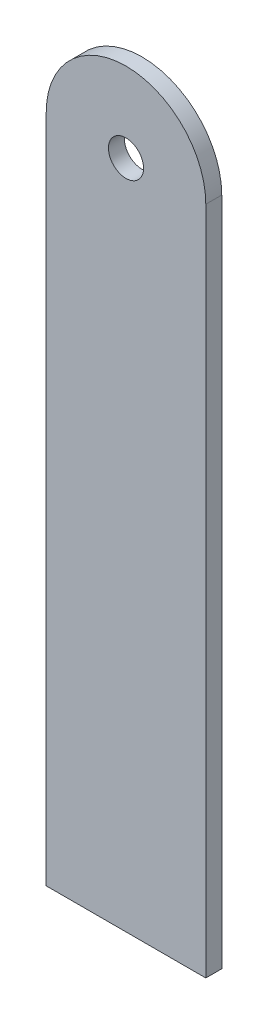
ISO-10303-21;
HEADER;
FILE_DESCRIPTION(('STEP AP214'),'2;1');
FILE_NAME('part.step','',(''),(''),'','','');
FILE_SCHEMA(('AUTOMOTIVE_DESIGN { 1 0 10303 214 1 1 1 1 }'));
ENDSEC;
DATA;
#1=APPLICATION_CONTEXT('core data for automotive mechanical design processes');
#2=APPLICATION_PROTOCOL_DEFINITION('international standard','automotive_design',2000,#1);
#3=PRODUCT_CONTEXT('',#1,'mechanical');
#4=PRODUCT('Part','Part','',(#3));
#5=PRODUCT_RELATED_PRODUCT_CATEGORY('part','',(#4));
#6=PRODUCT_DEFINITION_FORMATION('','',#4);
#7=PRODUCT_DEFINITION_CONTEXT('part definition',#1,'design');
#8=PRODUCT_DEFINITION('design','',#6,#7);
#9=PRODUCT_DEFINITION_SHAPE('','',#8);
#10=(LENGTH_UNIT() NAMED_UNIT(*) SI_UNIT(.MILLI.,.METRE.));
#11=(NAMED_UNIT(*) PLANE_ANGLE_UNIT() SI_UNIT($,.RADIAN.));
#12=(NAMED_UNIT(*) SI_UNIT($,.STERADIAN.) SOLID_ANGLE_UNIT());
#13=UNCERTAINTY_MEASURE_WITH_UNIT(LENGTH_MEASURE(1.E-05),#10,'distance_accuracy_value','');
#14=(GEOMETRIC_REPRESENTATION_CONTEXT(3) GLOBAL_UNCERTAINTY_ASSIGNED_CONTEXT((#13)) GLOBAL_UNIT_ASSIGNED_CONTEXT((#10,
#11,#12)) REPRESENTATION_CONTEXT('',''));
#15=CARTESIAN_POINT('',(0.,0.,0.));
#16=DIRECTION('',(0.,0.,1.));
#17=DIRECTION('',(1.,0.,0.));
#18=AXIS2_PLACEMENT_3D('',#15,#16,#17);
#19=CARTESIAN_POINT('',(25.,210.,5.));
#20=DIRECTION('',(0.,0.,-1.));
#21=DIRECTION('',(-1.,0.,0.));
#22=AXIS2_PLACEMENT_3D('',#19,#20,#21);
#23=PLANE('',#22);
#24=DIRECTION('',(1.,0.,0.));
#25=VECTOR('',#24,1.);
#26=CARTESIAN_POINT('',(50.,0.,5.));
#27=LINE('',#26,#25);
#28=CARTESIAN_POINT('',(0.,0.,5.));
#29=VERTEX_POINT('',#28);
#30=CARTESIAN_POINT('',(50.,0.,5.));
#31=VERTEX_POINT('',#30);
#32=EDGE_CURVE('E89',#29,#31,#27,.T.);
#33=ORIENTED_EDGE('',*,*,#32,.T.);
#34=DIRECTION('',(0.,1.,0.));
#35=VECTOR('',#34,1.);
#36=CARTESIAN_POINT('',(50.,210.,5.));
#37=LINE('',#36,#35);
#38=CARTESIAN_POINT('',(50.,210.,5.));
#39=VERTEX_POINT('',#38);
#40=EDGE_CURVE('E84',#31,#39,#37,.T.);
#41=ORIENTED_EDGE('',*,*,#40,.T.);
#42=CARTESIAN_POINT('',(25.,210.,5.));
#43=DIRECTION('',(0.,0.,1.));
#44=DIRECTION('',(-1.,0.,0.));
#45=AXIS2_PLACEMENT_3D('',#42,#43,#44);
#46=CIRCLE('',#45,25.);
#47=CARTESIAN_POINT('',(0.,210.,5.));
#48=VERTEX_POINT('',#47);
#49=EDGE_CURVE('E87',#39,#48,#46,.T.);
#50=ORIENTED_EDGE('',*,*,#49,.T.);
#51=DIRECTION('',(0.,-1.,0.));
#52=VECTOR('',#51,1.);
#53=CARTESIAN_POINT('',(0.,0.,5.));
#54=LINE('',#53,#52);
#55=EDGE_CURVE('E54',#48,#29,#54,.T.);
#56=ORIENTED_EDGE('',*,*,#55,.T.);
#57=EDGE_LOOP('',(#33,#41,#50,#56));
#58=FACE_BOUND('',#57,.T.);
#59=CARTESIAN_POINT('',(25.,210.,5.));
#60=DIRECTION('',(0.,0.,1.));
#61=DIRECTION('',(1.,0.,0.));
#62=AXIS2_PLACEMENT_3D('',#59,#60,#61);
#63=CIRCLE('',#62,5.5);
#64=CARTESIAN_POINT('',(30.5,210.,5.));
#65=VERTEX_POINT('',#64);
#66=EDGE_CURVE('E104',#65,#65,#63,.T.);
#67=ORIENTED_EDGE('',*,*,#66,.F.);
#68=EDGE_LOOP('',(#67));
#69=FACE_BOUND('',#68,.T.);
#70=ADVANCED_FACE('F37',(#58,#69),#23,.F.);
#71=CARTESIAN_POINT('',(25.,210.,0.));
#72=DIRECTION('',(0.,0.,-1.));
#73=DIRECTION('',(-1.,0.,0.));
#74=AXIS2_PLACEMENT_3D('',#71,#72,#73);
#75=PLANE('',#74);
#76=DIRECTION('',(1.,0.,0.));
#77=VECTOR('',#76,1.);
#78=CARTESIAN_POINT('',(50.,0.,0.));
#79=LINE('',#78,#77);
#80=CARTESIAN_POINT('',(0.,0.,0.));
#81=VERTEX_POINT('',#80);
#82=CARTESIAN_POINT('',(50.,0.,0.));
#83=VERTEX_POINT('',#82);
#84=EDGE_CURVE('E101',#81,#83,#79,.T.);
#85=ORIENTED_EDGE('',*,*,#84,.F.);
#86=DIRECTION('',(0.,-1.,0.));
#87=VECTOR('',#86,1.);
#88=CARTESIAN_POINT('',(0.,0.,0.));
#89=LINE('',#88,#87);
#90=CARTESIAN_POINT('',(0.,210.,0.));
#91=VERTEX_POINT('',#90);
#92=EDGE_CURVE('E77',#91,#81,#89,.T.);
#93=ORIENTED_EDGE('',*,*,#92,.F.);
#94=CARTESIAN_POINT('',(25.,210.,0.));
#95=DIRECTION('',(0.,0.,1.));
#96=DIRECTION('',(-1.,0.,0.));
#97=AXIS2_PLACEMENT_3D('',#94,#95,#96);
#98=CIRCLE('',#97,25.);
#99=CARTESIAN_POINT('',(50.,210.,0.));
#100=VERTEX_POINT('',#99);
#101=EDGE_CURVE('E71',#100,#91,#98,.T.);
#102=ORIENTED_EDGE('',*,*,#101,.F.);
#103=DIRECTION('',(0.,1.,0.));
#104=VECTOR('',#103,1.);
#105=CARTESIAN_POINT('',(50.,210.,0.));
#106=LINE('',#105,#104);
#107=EDGE_CURVE('E93',#83,#100,#106,.T.);
#108=ORIENTED_EDGE('',*,*,#107,.F.);
#109=EDGE_LOOP('',(#85,#93,#102,#108));
#110=FACE_BOUND('',#109,.T.);
#111=CARTESIAN_POINT('',(25.,210.,0.));
#112=DIRECTION('',(0.,0.,1.));
#113=DIRECTION('',(1.,0.,0.));
#114=AXIS2_PLACEMENT_3D('',#111,#112,#113);
#115=CIRCLE('',#114,5.5);
#116=CARTESIAN_POINT('',(30.5,210.,0.));
#117=VERTEX_POINT('',#116);
#118=EDGE_CURVE('E116',#117,#117,#115,.T.);
#119=ORIENTED_EDGE('',*,*,#118,.T.);
#120=EDGE_LOOP('',(#119));
#121=FACE_BOUND('',#120,.T.);
#122=ADVANCED_FACE('F112',(#110,#121),#75,.T.);
#123=CARTESIAN_POINT('',(50.,0.,5.));
#124=DIRECTION('',(0.,1.,0.));
#125=DIRECTION('',(0.,0.,1.));
#126=AXIS2_PLACEMENT_3D('',#123,#124,#125);
#127=PLANE('',#126);
#128=ORIENTED_EDGE('',*,*,#84,.T.);
#129=DIRECTION('',(0.,0.,-1.));
#130=VECTOR('',#129,1.);
#131=CARTESIAN_POINT('',(50.,0.,5.));
#132=LINE('',#131,#130);
#133=EDGE_CURVE('E11',#31,#83,#132,.T.);
#134=ORIENTED_EDGE('',*,*,#133,.F.);
#135=ORIENTED_EDGE('',*,*,#32,.F.);
#136=DIRECTION('',(0.,0.,-1.));
#137=VECTOR('',#136,1.);
#138=CARTESIAN_POINT('',(0.,0.,5.));
#139=LINE('',#138,#137);
#140=EDGE_CURVE('E97',#29,#81,#139,.T.);
#141=ORIENTED_EDGE('',*,*,#140,.T.);
#142=EDGE_LOOP('',(#128,#134,#135,#141));
#143=FACE_BOUND('',#142,.T.);
#144=ADVANCED_FACE('F39',(#143),#127,.F.);
#145=CARTESIAN_POINT('',(50.,210.,5.));
#146=DIRECTION('',(-1.,0.,0.));
#147=DIRECTION('',(0.,-1.,0.));
#148=AXIS2_PLACEMENT_3D('',#145,#146,#147);
#149=PLANE('',#148);
#150=ORIENTED_EDGE('',*,*,#107,.T.);
#151=DIRECTION('',(0.,0.,-1.));
#152=VECTOR('',#151,1.);
#153=CARTESIAN_POINT('',(50.,210.,5.));
#154=LINE('',#153,#152);
#155=EDGE_CURVE('E46',#39,#100,#154,.T.);
#156=ORIENTED_EDGE('',*,*,#155,.F.);
#157=ORIENTED_EDGE('',*,*,#40,.F.);
#158=ORIENTED_EDGE('',*,*,#133,.T.);
#159=EDGE_LOOP('',(#150,#156,#157,#158));
#160=FACE_BOUND('',#159,.T.);
#161=ADVANCED_FACE('F92',(#160),#149,.F.);
#162=CARTESIAN_POINT('',(25.,210.,5.));
#163=DIRECTION('',(0.,0.,-1.));
#164=DIRECTION('',(-1.,0.,0.));
#165=AXIS2_PLACEMENT_3D('',#162,#163,#164);
#166=CYLINDRICAL_SURFACE('',#165,25.);
#167=ORIENTED_EDGE('',*,*,#101,.T.);
#168=DIRECTION('',(0.,0.,-1.));
#169=VECTOR('',#168,1.);
#170=CARTESIAN_POINT('',(0.,210.,5.));
#171=LINE('',#170,#169);
#172=EDGE_CURVE('E94',#48,#91,#171,.T.);
#173=ORIENTED_EDGE('',*,*,#172,.F.);
#174=ORIENTED_EDGE('',*,*,#49,.F.);
#175=ORIENTED_EDGE('',*,*,#155,.T.);
#176=EDGE_LOOP('',(#167,#173,#174,#175));
#177=FACE_BOUND('',#176,.T.);
#178=ADVANCED_FACE('F95',(#177),#166,.T.);
#179=CARTESIAN_POINT('',(0.,0.,5.));
#180=DIRECTION('',(1.,0.,0.));
#181=DIRECTION('',(0.,0.,-1.));
#182=AXIS2_PLACEMENT_3D('',#179,#180,#181);
#183=PLANE('',#182);
#184=ORIENTED_EDGE('',*,*,#92,.T.);
#185=ORIENTED_EDGE('',*,*,#140,.F.);
#186=ORIENTED_EDGE('',*,*,#55,.F.);
#187=ORIENTED_EDGE('',*,*,#172,.T.);
#188=EDGE_LOOP('',(#184,#185,#186,#187));
#189=FACE_BOUND('',#188,.T.);
#190=ADVANCED_FACE('F109',(#189),#183,.F.);
#191=CARTESIAN_POINT('',(25.,210.,5.));
#192=DIRECTION('',(0.,0.,-1.));
#193=DIRECTION('',(-1.,0.,0.));
#194=AXIS2_PLACEMENT_3D('',#191,#192,#193);
#195=CYLINDRICAL_SURFACE('',#194,5.5);
#196=ORIENTED_EDGE('',*,*,#66,.T.);
#197=EDGE_LOOP('',(#196));
#198=FACE_BOUND('',#197,.T.);
#199=ORIENTED_EDGE('',*,*,#118,.F.);
#200=EDGE_LOOP('',(#199));
#201=FACE_BOUND('',#200,.T.);
#202=ADVANCED_FACE('F122',(#198,#201),#195,.F.);
#203=CLOSED_SHELL('',(#70,#122,#144,#161,#178,#190,#202));
#204=MANIFOLD_SOLID_BREP('B2',#203);
#205=ADVANCED_BREP_SHAPE_REPRESENTATION('',(#18,#204),#14);
#206=SHAPE_DEFINITION_REPRESENTATION(#9,#205);
ENDSEC;
END-ISO-10303-21;
